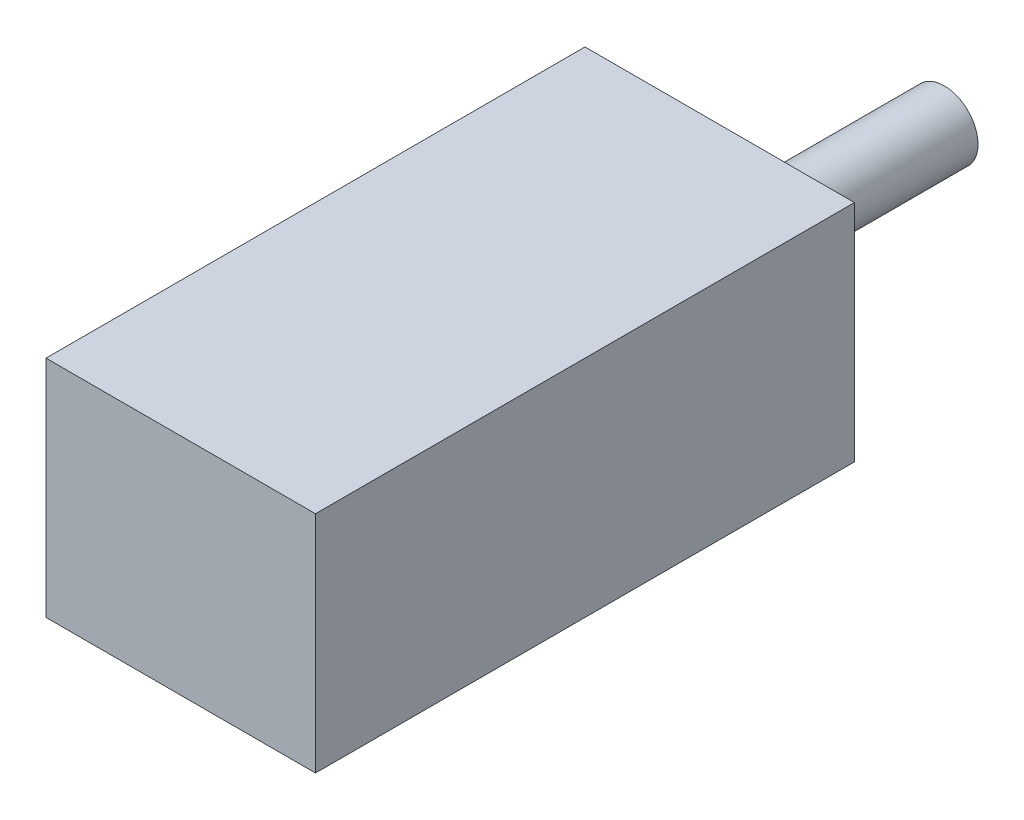
ISO-10303-21;
HEADER;
FILE_DESCRIPTION(('STEP AP214'),'2;1');
FILE_NAME('part.step','',(''),(''),'','','');
FILE_SCHEMA(('AUTOMOTIVE_DESIGN { 1 0 10303 214 1 1 1 1 }'));
ENDSEC;
DATA;
#1=APPLICATION_CONTEXT('core data for automotive mechanical design processes');
#2=APPLICATION_PROTOCOL_DEFINITION('international standard','automotive_design',2000,#1);
#3=PRODUCT_CONTEXT('',#1,'mechanical');
#4=PRODUCT('Part','Part','',(#3));
#5=PRODUCT_RELATED_PRODUCT_CATEGORY('part','',(#4));
#6=PRODUCT_DEFINITION_FORMATION('','',#4);
#7=PRODUCT_DEFINITION_CONTEXT('part definition',#1,'design');
#8=PRODUCT_DEFINITION('design','',#6,#7);
#9=PRODUCT_DEFINITION_SHAPE('','',#8);
#10=(LENGTH_UNIT() NAMED_UNIT(*) SI_UNIT(.MILLI.,.METRE.));
#11=(NAMED_UNIT(*) PLANE_ANGLE_UNIT() SI_UNIT($,.RADIAN.));
#12=(NAMED_UNIT(*) SI_UNIT($,.STERADIAN.) SOLID_ANGLE_UNIT());
#13=UNCERTAINTY_MEASURE_WITH_UNIT(LENGTH_MEASURE(1.E-05),#10,'distance_accuracy_value','');
#14=(GEOMETRIC_REPRESENTATION_CONTEXT(3) GLOBAL_UNCERTAINTY_ASSIGNED_CONTEXT((#13)) GLOBAL_UNIT_ASSIGNED_CONTEXT((#10,
#11,#12)) REPRESENTATION_CONTEXT('',''));
#15=CARTESIAN_POINT('',(0.,0.,0.));
#16=DIRECTION('',(0.,0.,1.));
#17=DIRECTION('',(1.,0.,0.));
#18=AXIS2_PLACEMENT_3D('',#15,#16,#17);
#19=CARTESIAN_POINT('',(6.,5.,24.));
#20=DIRECTION('',(-1.,0.,0.));
#21=DIRECTION('',(0.,-1.,0.));
#22=AXIS2_PLACEMENT_3D('',#19,#20,#21);
#23=PLANE('',#22);
#24=DIRECTION('',(0.,1.,0.));
#25=VECTOR('',#24,1.);
#26=CARTESIAN_POINT('',(6.,5.,0.));
#27=LINE('',#26,#25);
#28=CARTESIAN_POINT('',(6.,-5.,0.));
#29=VERTEX_POINT('',#28);
#30=CARTESIAN_POINT('',(6.,5.,0.));
#31=VERTEX_POINT('',#30);
#32=EDGE_CURVE('E99',#29,#31,#27,.T.);
#33=ORIENTED_EDGE('',*,*,#32,.T.);
#34=DIRECTION('',(0.,0.,-1.));
#35=VECTOR('',#34,1.);
#36=CARTESIAN_POINT('',(6.,5.,24.));
#37=LINE('',#36,#35);
#38=CARTESIAN_POINT('',(6.,5.,24.));
#39=VERTEX_POINT('',#38);
#40=EDGE_CURVE('E41',#39,#31,#37,.T.);
#41=ORIENTED_EDGE('',*,*,#40,.F.);
#42=DIRECTION('',(0.,1.,0.));
#43=VECTOR('',#42,1.);
#44=CARTESIAN_POINT('',(6.,5.,24.));
#45=LINE('',#44,#43);
#46=CARTESIAN_POINT('',(6.,-5.,24.));
#47=VERTEX_POINT('',#46);
#48=EDGE_CURVE('E85',#47,#39,#45,.T.);
#49=ORIENTED_EDGE('',*,*,#48,.F.);
#50=DIRECTION('',(0.,0.,-1.));
#51=VECTOR('',#50,1.);
#52=CARTESIAN_POINT('',(6.,-5.,24.));
#53=LINE('',#52,#51);
#54=EDGE_CURVE('E95',#47,#29,#53,.T.);
#55=ORIENTED_EDGE('',*,*,#54,.T.);
#56=EDGE_LOOP('',(#33,#41,#49,#55));
#57=FACE_BOUND('',#56,.T.);
#58=ADVANCED_FACE('F33',(#57),#23,.F.);
#59=CARTESIAN_POINT('',(-6.,5.,24.));
#60=DIRECTION('',(0.,-1.,0.));
#61=DIRECTION('',(0.,0.,-1.));
#62=AXIS2_PLACEMENT_3D('',#59,#60,#61);
#63=PLANE('',#62);
#64=DIRECTION('',(-1.,0.,0.));
#65=VECTOR('',#64,1.);
#66=CARTESIAN_POINT('',(-6.,5.,0.));
#67=LINE('',#66,#65);
#68=CARTESIAN_POINT('',(-6.,5.,0.));
#69=VERTEX_POINT('',#68);
#70=EDGE_CURVE('E90',#31,#69,#67,.T.);
#71=ORIENTED_EDGE('',*,*,#70,.T.);
#72=DIRECTION('',(0.,0.,-1.));
#73=VECTOR('',#72,1.);
#74=CARTESIAN_POINT('',(-6.,5.,24.));
#75=LINE('',#74,#73);
#76=CARTESIAN_POINT('',(-6.,5.,24.));
#77=VERTEX_POINT('',#76);
#78=EDGE_CURVE('E88',#77,#69,#75,.T.);
#79=ORIENTED_EDGE('',*,*,#78,.F.);
#80=DIRECTION('',(-1.,0.,0.));
#81=VECTOR('',#80,1.);
#82=CARTESIAN_POINT('',(-6.,5.,24.));
#83=LINE('',#82,#81);
#84=EDGE_CURVE('E80',#39,#77,#83,.T.);
#85=ORIENTED_EDGE('',*,*,#84,.F.);
#86=ORIENTED_EDGE('',*,*,#40,.T.);
#87=EDGE_LOOP('',(#71,#79,#85,#86));
#88=FACE_BOUND('',#87,.T.);
#89=ADVANCED_FACE('F89',(#88),#63,.F.);
#90=CARTESIAN_POINT('',(-6.,5.,24.));
#91=DIRECTION('',(1.,0.,0.));
#92=DIRECTION('',(0.,1.,0.));
#93=AXIS2_PLACEMENT_3D('',#90,#91,#92);
#94=PLANE('',#93);
#95=DIRECTION('',(0.,-1.,0.));
#96=VECTOR('',#95,1.);
#97=CARTESIAN_POINT('',(-6.,5.,0.));
#98=LINE('',#97,#96);
#99=CARTESIAN_POINT('',(-6.,-5.,0.));
#100=VERTEX_POINT('',#99);
#101=EDGE_CURVE('E66',#69,#100,#98,.T.);
#102=ORIENTED_EDGE('',*,*,#101,.T.);
#103=DIRECTION('',(0.,0.,-1.));
#104=VECTOR('',#103,1.);
#105=CARTESIAN_POINT('',(-6.,-5.,24.));
#106=LINE('',#105,#104);
#107=CARTESIAN_POINT('',(-6.,-5.,24.));
#108=VERTEX_POINT('',#107);
#109=EDGE_CURVE('E91',#108,#100,#106,.T.);
#110=ORIENTED_EDGE('',*,*,#109,.F.);
#111=DIRECTION('',(0.,-1.,0.));
#112=VECTOR('',#111,1.);
#113=CARTESIAN_POINT('',(-6.,5.,24.));
#114=LINE('',#113,#112);
#115=EDGE_CURVE('E83',#77,#108,#114,.T.);
#116=ORIENTED_EDGE('',*,*,#115,.F.);
#117=ORIENTED_EDGE('',*,*,#78,.T.);
#118=EDGE_LOOP('',(#102,#110,#116,#117));
#119=FACE_BOUND('',#118,.T.);
#120=ADVANCED_FACE('F93',(#119),#94,.F.);
#121=CARTESIAN_POINT('',(-6.,-5.,24.));
#122=DIRECTION('',(0.,1.,0.));
#123=DIRECTION('',(0.,0.,1.));
#124=AXIS2_PLACEMENT_3D('',#121,#122,#123);
#125=PLANE('',#124);
#126=DIRECTION('',(1.,0.,0.));
#127=VECTOR('',#126,1.);
#128=CARTESIAN_POINT('',(-6.,-5.,0.));
#129=LINE('',#128,#127);
#130=EDGE_CURVE('E72',#100,#29,#129,.T.);
#131=ORIENTED_EDGE('',*,*,#130,.T.);
#132=ORIENTED_EDGE('',*,*,#54,.F.);
#133=DIRECTION('',(1.,0.,0.));
#134=VECTOR('',#133,1.);
#135=CARTESIAN_POINT('',(-6.,-5.,24.));
#136=LINE('',#135,#134);
#137=EDGE_CURVE('E49',#108,#47,#136,.T.);
#138=ORIENTED_EDGE('',*,*,#137,.F.);
#139=ORIENTED_EDGE('',*,*,#109,.T.);
#140=EDGE_LOOP('',(#131,#132,#138,#139));
#141=FACE_BOUND('',#140,.T.);
#142=ADVANCED_FACE('F122',(#141),#125,.F.);
#143=CARTESIAN_POINT('',(0.,0.,24.));
#144=DIRECTION('',(0.,0.,1.));
#145=DIRECTION('',(1.,0.,0.));
#146=AXIS2_PLACEMENT_3D('',#143,#144,#145);
#147=PLANE('',#146);
#148=ORIENTED_EDGE('',*,*,#48,.T.);
#149=ORIENTED_EDGE('',*,*,#84,.T.);
#150=ORIENTED_EDGE('',*,*,#115,.T.);
#151=ORIENTED_EDGE('',*,*,#137,.T.);
#152=EDGE_LOOP('',(#148,#149,#150,#151));
#153=FACE_BOUND('',#152,.T.);
#154=ADVANCED_FACE('F81',(#153),#147,.T.);
#155=CARTESIAN_POINT('',(0.,0.,0.));
#156=DIRECTION('',(0.,0.,1.));
#157=DIRECTION('',(1.,0.,0.));
#158=AXIS2_PLACEMENT_3D('',#155,#156,#157);
#159=PLANE('',#158);
#160=CARTESIAN_POINT('',(0.,0.,0.));
#161=DIRECTION('',(0.,0.,1.));
#162=DIRECTION('',(1.,0.,0.));
#163=AXIS2_PLACEMENT_3D('',#160,#161,#162);
#164=CIRCLE('',#163,1.5);
#165=CARTESIAN_POINT('',(1.5,0.,0.));
#166=VERTEX_POINT('',#165);
#167=EDGE_CURVE('E11',#166,#166,#164,.F.);
#168=ORIENTED_EDGE('',*,*,#167,.F.);
#169=EDGE_LOOP('',(#168));
#170=FACE_BOUND('',#169,.T.);
#171=ORIENTED_EDGE('',*,*,#32,.F.);
#172=ORIENTED_EDGE('',*,*,#130,.F.);
#173=ORIENTED_EDGE('',*,*,#101,.F.);
#174=ORIENTED_EDGE('',*,*,#70,.F.);
#175=EDGE_LOOP('',(#171,#172,#173,#174));
#176=FACE_BOUND('',#175,.T.);
#177=ADVANCED_FACE('F110',(#170,#176),#159,.F.);
#178=CARTESIAN_POINT('',(0.,0.,-10.));
#179=DIRECTION('',(0.,0.,1.));
#180=DIRECTION('',(1.,0.,0.));
#181=AXIS2_PLACEMENT_3D('',#178,#179,#180);
#182=CYLINDRICAL_SURFACE('',#181,1.5);
#183=CARTESIAN_POINT('',(0.,0.,-10.));
#184=DIRECTION('',(0.,0.,-1.));
#185=DIRECTION('',(-1.,0.,0.));
#186=AXIS2_PLACEMENT_3D('',#183,#184,#185);
#187=CIRCLE('',#186,1.5);
#188=CARTESIAN_POINT('',(-1.5,0.,-10.));
#189=VERTEX_POINT('',#188);
#190=EDGE_CURVE('E102',#189,#189,#187,.T.);
#191=ORIENTED_EDGE('',*,*,#190,.F.);
#192=EDGE_LOOP('',(#191));
#193=FACE_BOUND('',#192,.T.);
#194=ORIENTED_EDGE('',*,*,#167,.T.);
#195=EDGE_LOOP('',(#194));
#196=FACE_BOUND('',#195,.T.);
#197=ADVANCED_FACE('F112',(#193,#196),#182,.T.);
#198=CARTESIAN_POINT('',(0.,0.,-10.));
#199=DIRECTION('',(0.,0.,-1.));
#200=DIRECTION('',(-1.,0.,0.));
#201=AXIS2_PLACEMENT_3D('',#198,#199,#200);
#202=PLANE('',#201);
#203=ORIENTED_EDGE('',*,*,#190,.T.);
#204=EDGE_LOOP('',(#203));
#205=FACE_BOUND('',#204,.T.);
#206=ADVANCED_FACE('F119',(#205),#202,.T.);
#207=CLOSED_SHELL('',(#58,#89,#120,#142,#154,#177,#197,#206));
#208=MANIFOLD_SOLID_BREP('B2',#207);
#209=ADVANCED_BREP_SHAPE_REPRESENTATION('',(#18,#208),#14);
#210=SHAPE_DEFINITION_REPRESENTATION(#9,#209);
ENDSEC;
END-ISO-10303-21;
